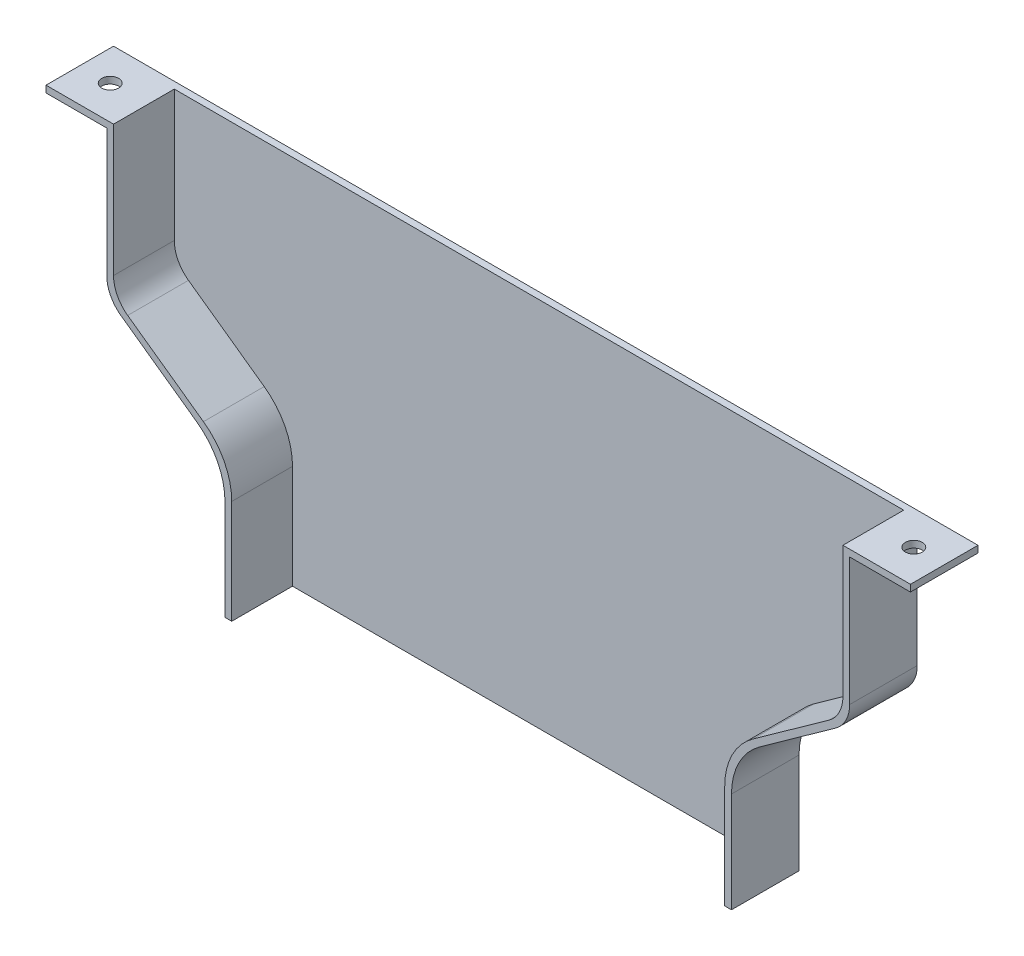
ISO-10303-21;
HEADER;
FILE_DESCRIPTION(('STEP AP214'),'2;1');
FILE_NAME('part.step','',(''),(''),'','','');
FILE_SCHEMA(('AUTOMOTIVE_DESIGN { 1 0 10303 214 1 1 1 1 }'));
ENDSEC;
DATA;
#1=APPLICATION_CONTEXT('core data for automotive mechanical design processes');
#2=APPLICATION_PROTOCOL_DEFINITION('international standard','automotive_design',2000,#1);
#3=PRODUCT_CONTEXT('',#1,'mechanical');
#4=PRODUCT('Part','Part','',(#3));
#5=PRODUCT_RELATED_PRODUCT_CATEGORY('part','',(#4));
#6=PRODUCT_DEFINITION_FORMATION('','',#4);
#7=PRODUCT_DEFINITION_CONTEXT('part definition',#1,'design');
#8=PRODUCT_DEFINITION('design','',#6,#7);
#9=PRODUCT_DEFINITION_SHAPE('','',#8);
#10=(LENGTH_UNIT() NAMED_UNIT(*) SI_UNIT(.MILLI.,.METRE.));
#11=(NAMED_UNIT(*) PLANE_ANGLE_UNIT() SI_UNIT($,.RADIAN.));
#12=(NAMED_UNIT(*) SI_UNIT($,.STERADIAN.) SOLID_ANGLE_UNIT());
#13=UNCERTAINTY_MEASURE_WITH_UNIT(LENGTH_MEASURE(1.E-05),#10,'distance_accuracy_value','');
#14=(GEOMETRIC_REPRESENTATION_CONTEXT(3) GLOBAL_UNCERTAINTY_ASSIGNED_CONTEXT((#13)) GLOBAL_UNIT_ASSIGNED_CONTEXT((#10,
#11,#12)) REPRESENTATION_CONTEXT('',''));
#15=CARTESIAN_POINT('',(0.,0.,0.));
#16=DIRECTION('',(0.,0.,1.));
#17=DIRECTION('',(1.,0.,0.));
#18=AXIS2_PLACEMENT_3D('',#15,#16,#17);
#19=CARTESIAN_POINT('',(-110.,110.,20.));
#20=DIRECTION('',(1.,0.,0.));
#21=DIRECTION('',(0.,1.,0.));
#22=AXIS2_PLACEMENT_3D('',#19,#20,#21);
#23=PLANE('',#22);
#24=DIRECTION('',(0.,0.,1.));
#25=VECTOR('',#24,1.);
#26=CARTESIAN_POINT('',(-110.,108.,20.));
#27=LINE('',#26,#25);
#28=CARTESIAN_POINT('',(-110.,108.,0.));
#29=VERTEX_POINT('',#28);
#30=CARTESIAN_POINT('',(-110.,108.,20.));
#31=VERTEX_POINT('',#30);
#32=EDGE_CURVE('E71',#29,#31,#27,.T.);
#33=ORIENTED_EDGE('',*,*,#32,.F.);
#34=DIRECTION('',(0.,-1.,0.));
#35=VECTOR('',#34,1.);
#36=CARTESIAN_POINT('',(-110.,110.,0.));
#37=LINE('',#36,#35);
#38=CARTESIAN_POINT('',(-110.,70.146178952918,0.));
#39=VERTEX_POINT('',#38);
#40=EDGE_CURVE('E354',#29,#39,#37,.T.);
#41=ORIENTED_EDGE('',*,*,#40,.T.);
#42=DIRECTION('',(0.,0.,-1.));
#43=VECTOR('',#42,1.);
#44=CARTESIAN_POINT('',(-110.,70.146178952918,20.));
#45=LINE('',#44,#43);
#46=CARTESIAN_POINT('',(-110.,70.146178952918,20.));
#47=VERTEX_POINT('',#46);
#48=EDGE_CURVE('E515',#39,#47,#45,.F.);
#49=ORIENTED_EDGE('',*,*,#48,.T.);
#50=DIRECTION('',(0.,-1.,0.));
#51=VECTOR('',#50,1.);
#52=CARTESIAN_POINT('',(-110.,110.,20.));
#53=LINE('',#52,#51);
#54=EDGE_CURVE('E67',#31,#47,#53,.T.);
#55=ORIENTED_EDGE('',*,*,#54,.F.);
#56=EDGE_LOOP('',(#33,#41,#49,#55));
#57=FACE_BOUND('',#56,.T.);
#58=ADVANCED_FACE('F51',(#57),#23,.F.);
#59=CARTESIAN_POINT('',(0.,0.,20.));
#60=DIRECTION('',(0.,0.,1.));
#61=DIRECTION('',(1.,0.,0.));
#62=AXIS2_PLACEMENT_3D('',#59,#60,#61);
#63=PLANE('',#62);
#64=DIRECTION('',(0.,1.,0.));
#65=VECTOR('',#64,1.);
#66=CARTESIAN_POINT('',(110.,110.,20.));
#67=LINE('',#66,#65);
#68=CARTESIAN_POINT('',(110.,70.1461789529181,20.));
#69=VERTEX_POINT('',#68);
#70=CARTESIAN_POINT('',(110.,108.,20.));
#71=VERTEX_POINT('',#70);
#72=EDGE_CURVE('E242',#69,#71,#67,.T.);
#73=ORIENTED_EDGE('',*,*,#72,.T.);
#74=DIRECTION('',(1.,0.,0.));
#75=VECTOR('',#74,1.);
#76=CARTESIAN_POINT('',(108.,108.,20.));
#77=LINE('',#76,#75);
#78=CARTESIAN_POINT('',(128.,108.,20.));
#79=VERTEX_POINT('',#78);
#80=EDGE_CURVE('E235',#71,#79,#77,.T.);
#81=ORIENTED_EDGE('',*,*,#80,.T.);
#82=DIRECTION('',(0.,1.,0.));
#83=VECTOR('',#82,1.);
#84=CARTESIAN_POINT('',(128.,108.,20.));
#85=LINE('',#84,#83);
#86=CARTESIAN_POINT('',(128.,110.,20.));
#87=VERTEX_POINT('',#86);
#88=EDGE_CURVE('E239',#79,#87,#85,.T.);
#89=ORIENTED_EDGE('',*,*,#88,.T.);
#90=DIRECTION('',(-1.,0.,0.));
#91=VECTOR('',#90,1.);
#92=CARTESIAN_POINT('',(110.,110.,20.));
#93=LINE('',#92,#91);
#94=CARTESIAN_POINT('',(108.,110.,20.));
#95=VERTEX_POINT('',#94);
#96=EDGE_CURVE('E380',#87,#95,#93,.T.);
#97=ORIENTED_EDGE('',*,*,#96,.T.);
#98=DIRECTION('',(0.,1.,0.));
#99=VECTOR('',#98,1.);
#100=CARTESIAN_POINT('',(108.,181.485608488668,20.));
#101=LINE('',#100,#99);
#102=CARTESIAN_POINT('',(108.,71.1754147435016,20.));
#103=VERTEX_POINT('',#102);
#104=EDGE_CURVE('E306',#103,#95,#101,.T.);
#105=ORIENTED_EDGE('',*,*,#104,.F.);
#106=CARTESIAN_POINT('',(98.,71.1754147435016,20.));
#107=DIRECTION('',(0.,0.,1.));
#108=DIRECTION('',(1.,0.,0.));
#109=AXIS2_PLACEMENT_3D('',#106,#107,#108);
#110=CIRCLE('',#109,10.);
#111=CARTESIAN_POINT('',(103.812381937191,63.0380800314342,20.));
#112=VERTEX_POINT('',#111);
#113=EDGE_CURVE('E60',#103,#112,#110,.F.);
#114=ORIENTED_EDGE('',*,*,#113,.T.);
#115=DIRECTION('',(0.813733471206735,0.581238193719096,0.));
#116=VECTOR('',#115,1.);
#117=CARTESIAN_POINT('',(108.,66.0292357905835,20.));
#118=LINE('',#117,#116);
#119=CARTESIAN_POINT('',(81.3752361256181,47.0115473088822,20.));
#120=VERTEX_POINT('',#119);
#121=EDGE_CURVE('E329',#120,#112,#118,.T.);
#122=ORIENTED_EDGE('',*,*,#121,.F.);
#123=CARTESIAN_POINT('',(93.,30.7368778847475,20.));
#124=DIRECTION('',(0.,0.,1.));
#125=DIRECTION('',(1.,0.,0.));
#126=AXIS2_PLACEMENT_3D('',#123,#124,#125);
#127=CIRCLE('',#126,20.);
#128=CARTESIAN_POINT('',(73.,30.7368778847475,20.));
#129=VERTEX_POINT('',#128);
#130=EDGE_CURVE('E476',#120,#129,#127,.T.);
#131=ORIENTED_EDGE('',*,*,#130,.T.);
#132=DIRECTION('',(0.,1.,0.));
#133=VECTOR('',#132,1.);
#134=CARTESIAN_POINT('',(73.,0.,20.));
#135=LINE('',#134,#133);
#136=CARTESIAN_POINT('',(73.,0.,20.));
#137=VERTEX_POINT('',#136);
#138=EDGE_CURVE('E419',#137,#129,#135,.T.);
#139=ORIENTED_EDGE('',*,*,#138,.F.);
#140=DIRECTION('',(1.,0.,0.));
#141=VECTOR('',#140,1.);
#142=CARTESIAN_POINT('',(-75.,0.,20.));
#143=LINE('',#142,#141);
#144=CARTESIAN_POINT('',(75.,0.,20.));
#145=VERTEX_POINT('',#144);
#146=EDGE_CURVE('E364',#137,#145,#143,.T.);
#147=ORIENTED_EDGE('',*,*,#146,.T.);
#148=DIRECTION('',(0.,1.,0.));
#149=VECTOR('',#148,1.);
#150=CARTESIAN_POINT('',(75.,40.,20.));
#151=LINE('',#150,#149);
#152=CARTESIAN_POINT('',(75.,29.7076420941639,20.));
#153=VERTEX_POINT('',#152);
#154=EDGE_CURVE('E369',#145,#153,#151,.T.);
#155=ORIENTED_EDGE('',*,*,#154,.T.);
#156=CARTESIAN_POINT('',(95.,29.707642094164,20.));
#157=DIRECTION('',(0.,0.,1.));
#158=DIRECTION('',(1.,0.,0.));
#159=AXIS2_PLACEMENT_3D('',#156,#157,#158);
#160=CIRCLE('',#159,20.);
#161=CARTESIAN_POINT('',(83.3752361256181,45.9823115182987,20.));
#162=VERTEX_POINT('',#161);
#163=EDGE_CURVE('E460',#153,#162,#160,.F.);
#164=ORIENTED_EDGE('',*,*,#163,.T.);
#165=DIRECTION('',(0.813733471206735,0.581238193719096,0.));
#166=VECTOR('',#165,1.);
#167=CARTESIAN_POINT('',(110.,65.,20.));
#168=LINE('',#167,#166);
#169=CARTESIAN_POINT('',(105.812381937191,62.0088442408507,20.));
#170=VERTEX_POINT('',#169);
#171=EDGE_CURVE('E373',#162,#170,#168,.T.);
#172=ORIENTED_EDGE('',*,*,#171,.T.);
#173=CARTESIAN_POINT('',(100.,70.146178952918,20.));
#174=DIRECTION('',(0.,0.,1.));
#175=DIRECTION('',(1.,0.,0.));
#176=AXIS2_PLACEMENT_3D('',#173,#174,#175);
#177=CIRCLE('',#176,10.);
#178=EDGE_CURVE('E528',#170,#69,#177,.T.);
#179=ORIENTED_EDGE('',*,*,#178,.T.);
#180=EDGE_LOOP('',(#73,#81,#89,#97,#105,#114,#122,#131,#139,#147,#155,#164,#172,#179));
#181=FACE_BOUND('',#180,.T.);
#182=ADVANCED_FACE('F237',(#181),#63,.T.);
#183=CARTESIAN_POINT('',(-110.,65.,20.));
#184=DIRECTION('',(0.581238193719096,0.813733471206736,0.));
#185=DIRECTION('',(-0.813733471206736,0.581238193719096,0.));
#186=AXIS2_PLACEMENT_3D('',#183,#184,#185);
#187=PLANE('',#186);
#188=DIRECTION('',(0.813733471206736,-0.581238193719096,0.));
#189=VECTOR('',#188,1.);
#190=CARTESIAN_POINT('',(-110.,65.,20.));
#191=LINE('',#190,#189);
#192=CARTESIAN_POINT('',(-105.812381937191,62.0088442408506,20.));
#193=VERTEX_POINT('',#192);
#194=CARTESIAN_POINT('',(-83.3752361256181,45.9823115182986,20.));
#195=VERTEX_POINT('',#194);
#196=EDGE_CURVE('E357',#193,#195,#191,.T.);
#197=ORIENTED_EDGE('',*,*,#196,.F.);
#198=DIRECTION('',(0.,0.,-1.));
#199=VECTOR('',#198,1.);
#200=CARTESIAN_POINT('',(-105.812381937191,62.0088442408506,20.));
#201=LINE('',#200,#199);
#202=CARTESIAN_POINT('',(-105.812381937191,62.0088442408506,0.));
#203=VERTEX_POINT('',#202);
#204=EDGE_CURVE('E504',#193,#203,#201,.T.);
#205=ORIENTED_EDGE('',*,*,#204,.T.);
#206=DIRECTION('',(0.813733471206736,-0.581238193719096,0.));
#207=VECTOR('',#206,1.);
#208=CARTESIAN_POINT('',(-110.,65.,0.));
#209=LINE('',#208,#207);
#210=CARTESIAN_POINT('',(-83.3752361256181,45.9823115182986,0.));
#211=VERTEX_POINT('',#210);
#212=EDGE_CURVE('E386',#203,#211,#209,.T.);
#213=ORIENTED_EDGE('',*,*,#212,.T.);
#214=DIRECTION('',(0.,0.,-1.));
#215=VECTOR('',#214,1.);
#216=CARTESIAN_POINT('',(-83.3752361256181,45.9823115182986,20.));
#217=LINE('',#216,#215);
#218=EDGE_CURVE('E438',#211,#195,#217,.F.);
#219=ORIENTED_EDGE('',*,*,#218,.T.);
#220=EDGE_LOOP('',(#197,#205,#213,#219));
#221=FACE_BOUND('',#220,.T.);
#222=ADVANCED_FACE('F611',(#221),#187,.F.);
#223=CARTESIAN_POINT('',(-75.,40.,20.));
#224=DIRECTION('',(1.,0.,0.));
#225=DIRECTION('',(0.,0.,-1.));
#226=AXIS2_PLACEMENT_3D('',#223,#224,#225);
#227=PLANE('',#226);
#228=DIRECTION('',(0.,-1.,0.));
#229=VECTOR('',#228,1.);
#230=CARTESIAN_POINT('',(-75.,40.,20.));
#231=LINE('',#230,#229);
#232=CARTESIAN_POINT('',(-75.,29.7076420941639,20.));
#233=VERTEX_POINT('',#232);
#234=CARTESIAN_POINT('',(-75.,0.,20.));
#235=VERTEX_POINT('',#234);
#236=EDGE_CURVE('E361',#233,#235,#231,.T.);
#237=ORIENTED_EDGE('',*,*,#236,.F.);
#238=DIRECTION('',(0.,0.,-1.));
#239=VECTOR('',#238,1.);
#240=CARTESIAN_POINT('',(-75.,29.7076420941639,0.));
#241=LINE('',#240,#239);
#242=CARTESIAN_POINT('',(-75.,29.7076420941639,0.));
#243=VERTEX_POINT('',#242);
#244=EDGE_CURVE('E434',#233,#243,#241,.T.);
#245=ORIENTED_EDGE('',*,*,#244,.T.);
#246=DIRECTION('',(0.,-1.,0.));
#247=VECTOR('',#246,1.);
#248=CARTESIAN_POINT('',(-75.,40.,0.));
#249=LINE('',#248,#247);
#250=CARTESIAN_POINT('',(-75.,0.,0.));
#251=VERTEX_POINT('',#250);
#252=EDGE_CURVE('E389',#243,#251,#249,.T.);
#253=ORIENTED_EDGE('',*,*,#252,.T.);
#254=DIRECTION('',(0.,0.,-1.));
#255=VECTOR('',#254,1.);
#256=CARTESIAN_POINT('',(-75.,0.,20.));
#257=LINE('',#256,#255);
#258=EDGE_CURVE('E412',#235,#251,#257,.T.);
#259=ORIENTED_EDGE('',*,*,#258,.F.);
#260=EDGE_LOOP('',(#237,#245,#253,#259));
#261=FACE_BOUND('',#260,.T.);
#262=ADVANCED_FACE('F622',(#261),#227,.F.);
#263=CARTESIAN_POINT('',(-75.,0.,20.));
#264=DIRECTION('',(0.,1.,0.));
#265=DIRECTION('',(-1.,0.,0.));
#266=AXIS2_PLACEMENT_3D('',#263,#264,#265);
#267=PLANE('',#266);
#268=ORIENTED_EDGE('',*,*,#146,.F.);
#269=DIRECTION('',(0.,0.,-1.));
#270=VECTOR('',#269,1.);
#271=CARTESIAN_POINT('',(73.,0.,20.));
#272=LINE('',#271,#270);
#273=CARTESIAN_POINT('',(73.,0.,2.));
#274=VERTEX_POINT('',#273);
#275=EDGE_CURVE('E342',#137,#274,#272,.T.);
#276=ORIENTED_EDGE('',*,*,#275,.T.);
#277=DIRECTION('',(-1.,0.,0.));
#278=VECTOR('',#277,1.);
#279=CARTESIAN_POINT('',(-75.,0.,2.));
#280=LINE('',#279,#278);
#281=CARTESIAN_POINT('',(-73.,0.,2.));
#282=VERTEX_POINT('',#281);
#283=EDGE_CURVE('E350',#274,#282,#280,.T.);
#284=ORIENTED_EDGE('',*,*,#283,.T.);
#285=DIRECTION('',(0.,0.,1.));
#286=VECTOR('',#285,1.);
#287=CARTESIAN_POINT('',(-73.,0.,20.));
#288=LINE('',#287,#286);
#289=CARTESIAN_POINT('',(-73.,0.,20.));
#290=VERTEX_POINT('',#289);
#291=EDGE_CURVE('E338',#282,#290,#288,.T.);
#292=ORIENTED_EDGE('',*,*,#291,.T.);
#293=EDGE_CURVE('E365',#235,#290,#143,.T.);
#294=ORIENTED_EDGE('',*,*,#293,.F.);
#295=ORIENTED_EDGE('',*,*,#258,.T.);
#296=DIRECTION('',(1.,0.,0.));
#297=VECTOR('',#296,1.);
#298=CARTESIAN_POINT('',(-75.,0.,0.));
#299=LINE('',#298,#297);
#300=CARTESIAN_POINT('',(75.,0.,0.));
#301=VERTEX_POINT('',#300);
#302=EDGE_CURVE('E392',#251,#301,#299,.T.);
#303=ORIENTED_EDGE('',*,*,#302,.T.);
#304=DIRECTION('',(0.,0.,-1.));
#305=VECTOR('',#304,1.);
#306=CARTESIAN_POINT('',(75.,0.,20.));
#307=LINE('',#306,#305);
#308=EDGE_CURVE('E383',#145,#301,#307,.T.);
#309=ORIENTED_EDGE('',*,*,#308,.F.);
#310=EDGE_LOOP('',(#268,#276,#284,#292,#294,#295,#303,#309));
#311=FACE_BOUND('',#310,.T.);
#312=ADVANCED_FACE('F577',(#311),#267,.F.);
#313=CARTESIAN_POINT('',(75.,40.,20.));
#314=DIRECTION('',(-1.,0.,0.));
#315=DIRECTION('',(0.,-1.,0.));
#316=AXIS2_PLACEMENT_3D('',#313,#314,#315);
#317=PLANE('',#316);
#318=DIRECTION('',(0.,1.,0.));
#319=VECTOR('',#318,1.);
#320=CARTESIAN_POINT('',(75.,40.,0.));
#321=LINE('',#320,#319);
#322=CARTESIAN_POINT('',(75.,29.7076420941639,0.));
#323=VERTEX_POINT('',#322);
#324=EDGE_CURVE('E395',#301,#323,#321,.T.);
#325=ORIENTED_EDGE('',*,*,#324,.T.);
#326=DIRECTION('',(0.,0.,-1.));
#327=VECTOR('',#326,1.);
#328=CARTESIAN_POINT('',(75.,29.7076420941639,20.));
#329=LINE('',#328,#327);
#330=EDGE_CURVE('E431',#323,#153,#329,.F.);
#331=ORIENTED_EDGE('',*,*,#330,.T.);
#332=ORIENTED_EDGE('',*,*,#154,.F.);
#333=ORIENTED_EDGE('',*,*,#308,.T.);
#334=EDGE_LOOP('',(#325,#331,#332,#333));
#335=FACE_BOUND('',#334,.T.);
#336=ADVANCED_FACE('F627',(#335),#317,.F.);
#337=CARTESIAN_POINT('',(110.,65.,20.));
#338=DIRECTION('',(-0.581238193719096,0.813733471206735,0.));
#339=DIRECTION('',(-0.813733471206735,-0.581238193719096,0.));
#340=AXIS2_PLACEMENT_3D('',#337,#338,#339);
#341=PLANE('',#340);
#342=DIRECTION('',(0.813733471206735,0.581238193719096,0.));
#343=VECTOR('',#342,1.);
#344=CARTESIAN_POINT('',(110.,65.,0.));
#345=LINE('',#344,#343);
#346=CARTESIAN_POINT('',(83.3752361256181,45.9823115182987,0.));
#347=VERTEX_POINT('',#346);
#348=CARTESIAN_POINT('',(105.812381937191,62.0088442408507,0.));
#349=VERTEX_POINT('',#348);
#350=EDGE_CURVE('E399',#347,#349,#345,.T.);
#351=ORIENTED_EDGE('',*,*,#350,.T.);
#352=DIRECTION('',(0.,0.,-1.));
#353=VECTOR('',#352,1.);
#354=CARTESIAN_POINT('',(105.812381937191,62.0088442408507,20.));
#355=LINE('',#354,#353);
#356=EDGE_CURVE('E525',#349,#170,#355,.F.);
#357=ORIENTED_EDGE('',*,*,#356,.T.);
#358=ORIENTED_EDGE('',*,*,#171,.F.);
#359=DIRECTION('',(0.,0.,-1.));
#360=VECTOR('',#359,1.);
#361=CARTESIAN_POINT('',(83.3752361256181,45.9823115182987,0.));
#362=LINE('',#361,#360);
#363=EDGE_CURVE('E427',#162,#347,#362,.T.);
#364=ORIENTED_EDGE('',*,*,#363,.T.);
#365=EDGE_LOOP('',(#351,#357,#358,#364));
#366=FACE_BOUND('',#365,.T.);
#367=ADVANCED_FACE('F635',(#366),#341,.F.);
#368=CARTESIAN_POINT('',(110.,110.,20.));
#369=DIRECTION('',(-1.,0.,0.));
#370=DIRECTION('',(0.,-1.,0.));
#371=AXIS2_PLACEMENT_3D('',#368,#369,#370);
#372=PLANE('',#371);
#373=DIRECTION('',(0.,1.,0.));
#374=VECTOR('',#373,1.);
#375=CARTESIAN_POINT('',(110.,110.,0.));
#376=LINE('',#375,#374);
#377=CARTESIAN_POINT('',(110.,70.1461789529181,0.));
#378=VERTEX_POINT('',#377);
#379=CARTESIAN_POINT('',(110.,108.,0.));
#380=VERTEX_POINT('',#379);
#381=EDGE_CURVE('E403',#378,#380,#376,.T.);
#382=ORIENTED_EDGE('',*,*,#381,.T.);
#383=DIRECTION('',(0.,0.,1.));
#384=VECTOR('',#383,1.);
#385=CARTESIAN_POINT('',(110.,108.,20.));
#386=LINE('',#385,#384);
#387=EDGE_CURVE('E298',#380,#71,#386,.T.);
#388=ORIENTED_EDGE('',*,*,#387,.T.);
#389=ORIENTED_EDGE('',*,*,#72,.F.);
#390=DIRECTION('',(0.,0.,-1.));
#391=VECTOR('',#390,1.);
#392=CARTESIAN_POINT('',(110.,70.146178952918,20.));
#393=LINE('',#392,#391);
#394=EDGE_CURVE('E521',#69,#378,#393,.T.);
#395=ORIENTED_EDGE('',*,*,#394,.T.);
#396=EDGE_LOOP('',(#382,#388,#389,#395));
#397=FACE_BOUND('',#396,.T.);
#398=ADVANCED_FACE('F640',(#397),#372,.F.);
#399=CARTESIAN_POINT('',(110.,110.,20.));
#400=DIRECTION('',(0.,-1.,0.));
#401=DIRECTION('',(1.,0.,0.));
#402=AXIS2_PLACEMENT_3D('',#399,#400,#401);
#403=PLANE('',#402);
#404=CARTESIAN_POINT('',(119.,110.,10.));
#405=DIRECTION('',(0.,-1.,0.));
#406=DIRECTION('',(1.,0.,0.));
#407=AXIS2_PLACEMENT_3D('',#404,#405,#406);
#408=CIRCLE('',#407,2.5);
#409=CARTESIAN_POINT('',(121.5,110.,10.));
#410=VERTEX_POINT('',#409);
#411=EDGE_CURVE('E282',#410,#410,#408,.T.);
#412=ORIENTED_EDGE('',*,*,#411,.T.);
#413=EDGE_LOOP('',(#412));
#414=FACE_BOUND('',#413,.T.);
#415=CARTESIAN_POINT('',(-119.,110.,9.99999999999997));
#416=DIRECTION('',(0.,-1.,0.));
#417=DIRECTION('',(1.,0.,0.));
#418=AXIS2_PLACEMENT_3D('',#415,#416,#417);
#419=CIRCLE('',#418,2.5);
#420=CARTESIAN_POINT('',(-116.5,110.,9.99999999999997));
#421=VERTEX_POINT('',#420);
#422=EDGE_CURVE('E893',#421,#421,#419,.T.);
#423=ORIENTED_EDGE('',*,*,#422,.T.);
#424=EDGE_LOOP('',(#423));
#425=FACE_BOUND('',#424,.T.);
#426=DIRECTION('',(1.,0.,0.));
#427=VECTOR('',#426,1.);
#428=CARTESIAN_POINT('',(110.,110.,2.));
#429=LINE('',#428,#427);
#430=CARTESIAN_POINT('',(-108.,110.,2.));
#431=VERTEX_POINT('',#430);
#432=CARTESIAN_POINT('',(108.,110.,2.));
#433=VERTEX_POINT('',#432);
#434=EDGE_CURVE('E423',#431,#433,#429,.T.);
#435=ORIENTED_EDGE('',*,*,#434,.T.);
#436=DIRECTION('',(0.,0.,1.));
#437=VECTOR('',#436,1.);
#438=CARTESIAN_POINT('',(108.,110.,20.));
#439=LINE('',#438,#437);
#440=EDGE_CURVE('E346',#433,#95,#439,.T.);
#441=ORIENTED_EDGE('',*,*,#440,.T.);
#442=ORIENTED_EDGE('',*,*,#96,.F.);
#443=DIRECTION('',(0.,0.,-1.));
#444=VECTOR('',#443,1.);
#445=CARTESIAN_POINT('',(128.,110.,20.));
#446=LINE('',#445,#444);
#447=CARTESIAN_POINT('',(128.,110.,0.));
#448=VERTEX_POINT('',#447);
#449=EDGE_CURVE('E248',#87,#448,#446,.T.);
#450=ORIENTED_EDGE('',*,*,#449,.T.);
#451=DIRECTION('',(-1.,0.,0.));
#452=VECTOR('',#451,1.);
#453=CARTESIAN_POINT('',(110.,110.,0.));
#454=LINE('',#453,#452);
#455=CARTESIAN_POINT('',(-128.,110.,0.));
#456=VERTEX_POINT('',#455);
#457=EDGE_CURVE('E358',#448,#456,#454,.T.);
#458=ORIENTED_EDGE('',*,*,#457,.T.);
#459=DIRECTION('',(0.,0.,1.));
#460=VECTOR('',#459,1.);
#461=CARTESIAN_POINT('',(-128.,110.,20.));
#462=LINE('',#461,#460);
#463=CARTESIAN_POINT('',(-128.,110.,20.));
#464=VERTEX_POINT('',#463);
#465=EDGE_CURVE('E270',#456,#464,#462,.T.);
#466=ORIENTED_EDGE('',*,*,#465,.T.);
#467=CARTESIAN_POINT('',(-108.,110.,20.));
#468=VERTEX_POINT('',#467);
#469=EDGE_CURVE('E379',#468,#464,#93,.T.);
#470=ORIENTED_EDGE('',*,*,#469,.F.);
#471=DIRECTION('',(0.,0.,-1.));
#472=VECTOR('',#471,1.);
#473=CARTESIAN_POINT('',(-108.,110.,20.));
#474=LINE('',#473,#472);
#475=EDGE_CURVE('E323',#468,#431,#474,.T.);
#476=ORIENTED_EDGE('',*,*,#475,.T.);
#477=EDGE_LOOP('',(#435,#441,#442,#450,#458,#466,#470,#476));
#478=FACE_BOUND('',#477,.T.);
#479=ADVANCED_FACE('F549',(#414,#425,#478),#403,.F.);
#480=ORIENTED_EDGE('',*,*,#469,.T.);
#481=DIRECTION('',(0.,1.,0.));
#482=VECTOR('',#481,1.);
#483=CARTESIAN_POINT('',(-128.,108.,20.));
#484=LINE('',#483,#482);
#485=CARTESIAN_POINT('',(-128.,108.,20.));
#486=VERTEX_POINT('',#485);
#487=EDGE_CURVE('E278',#486,#464,#484,.T.);
#488=ORIENTED_EDGE('',*,*,#487,.F.);
#489=DIRECTION('',(1.,0.,0.));
#490=VECTOR('',#489,1.);
#491=CARTESIAN_POINT('',(-108.,108.,20.));
#492=LINE('',#491,#490);
#493=EDGE_CURVE('E277',#486,#31,#492,.T.);
#494=ORIENTED_EDGE('',*,*,#493,.T.);
#495=ORIENTED_EDGE('',*,*,#54,.T.);
#496=CARTESIAN_POINT('',(-100.,70.146178952918,20.));
#497=DIRECTION('',(0.,0.,1.));
#498=DIRECTION('',(1.,0.,0.));
#499=AXIS2_PLACEMENT_3D('',#496,#497,#498);
#500=CIRCLE('',#499,10.);
#501=EDGE_CURVE('E518',#47,#193,#500,.T.);
#502=ORIENTED_EDGE('',*,*,#501,.T.);
#503=ORIENTED_EDGE('',*,*,#196,.T.);
#504=CARTESIAN_POINT('',(-95.,29.7076420941639,20.));
#505=DIRECTION('',(0.,0.,1.));
#506=DIRECTION('',(1.,0.,0.));
#507=AXIS2_PLACEMENT_3D('',#504,#505,#506);
#508=CIRCLE('',#507,20.);
#509=EDGE_CURVE('E467',#195,#233,#508,.F.);
#510=ORIENTED_EDGE('',*,*,#509,.T.);
#511=ORIENTED_EDGE('',*,*,#236,.T.);
#512=ORIENTED_EDGE('',*,*,#293,.T.);
#513=DIRECTION('',(0.,-1.,0.));
#514=VECTOR('',#513,1.);
#515=CARTESIAN_POINT('',(-73.,-7.12974786719496,20.));
#516=LINE('',#515,#514);
#517=CARTESIAN_POINT('',(-73.,30.7368778847475,20.));
#518=VERTEX_POINT('',#517);
#519=EDGE_CURVE('E326',#518,#290,#516,.T.);
#520=ORIENTED_EDGE('',*,*,#519,.F.);
#521=CARTESIAN_POINT('',(-93.,30.7368778847475,20.));
#522=DIRECTION('',(0.,0.,1.));
#523=DIRECTION('',(1.,0.,0.));
#524=AXIS2_PLACEMENT_3D('',#521,#522,#523);
#525=CIRCLE('',#524,20.);
#526=CARTESIAN_POINT('',(-81.3752361256181,47.0115473088822,20.));
#527=VERTEX_POINT('',#526);
#528=EDGE_CURVE('E479',#518,#527,#525,.T.);
#529=ORIENTED_EDGE('',*,*,#528,.T.);
#530=DIRECTION('',(0.813733471206735,-0.581238193719096,0.));
#531=VECTOR('',#530,1.);
#532=CARTESIAN_POINT('',(-108.,66.0292357905835,20.));
#533=LINE('',#532,#531);
#534=CARTESIAN_POINT('',(-103.812381937191,63.0380800314342,20.));
#535=VERTEX_POINT('',#534);
#536=EDGE_CURVE('E301',#535,#527,#533,.T.);
#537=ORIENTED_EDGE('',*,*,#536,.F.);
#538=CARTESIAN_POINT('',(-98.,71.1754147435016,20.));
#539=DIRECTION('',(0.,0.,1.));
#540=DIRECTION('',(1.,0.,0.));
#541=AXIS2_PLACEMENT_3D('',#538,#539,#540);
#542=CIRCLE('',#541,10.);
#543=CARTESIAN_POINT('',(-108.,71.1754147435016,20.));
#544=VERTEX_POINT('',#543);
#545=EDGE_CURVE('E11',#535,#544,#542,.F.);
#546=ORIENTED_EDGE('',*,*,#545,.T.);
#547=DIRECTION('',(0.,-1.,0.));
#548=VECTOR('',#547,1.);
#549=CARTESIAN_POINT('',(-108.,0.,20.));
#550=LINE('',#549,#548);
#551=EDGE_CURVE('E416',#468,#544,#550,.T.);
#552=ORIENTED_EDGE('',*,*,#551,.F.);
#553=EDGE_LOOP('',(#480,#488,#494,#495,#502,#503,#510,#511,#512,#520,#529,#537,#546,#552));
#554=FACE_BOUND('',#553,.T.);
#555=ADVANCED_FACE('F591',(#554),#63,.T.);
#556=CARTESIAN_POINT('',(0.,0.,0.));
#557=DIRECTION('',(0.,0.,1.));
#558=DIRECTION('',(1.,0.,0.));
#559=AXIS2_PLACEMENT_3D('',#556,#557,#558);
#560=PLANE('',#559);
#561=DIRECTION('',(0.,1.,0.));
#562=VECTOR('',#561,1.);
#563=CARTESIAN_POINT('',(-128.,108.,0.));
#564=LINE('',#563,#562);
#565=CARTESIAN_POINT('',(-128.,108.,0.));
#566=VERTEX_POINT('',#565);
#567=EDGE_CURVE('E273',#566,#456,#564,.T.);
#568=ORIENTED_EDGE('',*,*,#567,.T.);
#569=ORIENTED_EDGE('',*,*,#457,.F.);
#570=DIRECTION('',(0.,1.,0.));
#571=VECTOR('',#570,1.);
#572=CARTESIAN_POINT('',(128.,108.,0.));
#573=LINE('',#572,#571);
#574=CARTESIAN_POINT('',(128.,108.,0.));
#575=VERTEX_POINT('',#574);
#576=EDGE_CURVE('E257',#575,#448,#573,.T.);
#577=ORIENTED_EDGE('',*,*,#576,.F.);
#578=DIRECTION('',(-1.,0.,0.));
#579=VECTOR('',#578,1.);
#580=CARTESIAN_POINT('',(108.,108.,0.));
#581=LINE('',#580,#579);
#582=EDGE_CURVE('E258',#575,#380,#581,.T.);
#583=ORIENTED_EDGE('',*,*,#582,.T.);
#584=ORIENTED_EDGE('',*,*,#381,.F.);
#585=CARTESIAN_POINT('',(100.,70.146178952918,0.));
#586=DIRECTION('',(0.,0.,1.));
#587=DIRECTION('',(1.,0.,0.));
#588=AXIS2_PLACEMENT_3D('',#585,#586,#587);
#589=CIRCLE('',#588,10.);
#590=EDGE_CURVE('E508',#378,#349,#589,.F.);
#591=ORIENTED_EDGE('',*,*,#590,.T.);
#592=ORIENTED_EDGE('',*,*,#350,.F.);
#593=CARTESIAN_POINT('',(95.,29.707642094164,0.));
#594=DIRECTION('',(0.,0.,1.));
#595=DIRECTION('',(1.,0.,0.));
#596=AXIS2_PLACEMENT_3D('',#593,#594,#595);
#597=CIRCLE('',#596,20.);
#598=EDGE_CURVE('E457',#347,#323,#597,.T.);
#599=ORIENTED_EDGE('',*,*,#598,.T.);
#600=ORIENTED_EDGE('',*,*,#324,.F.);
#601=ORIENTED_EDGE('',*,*,#302,.F.);
#602=ORIENTED_EDGE('',*,*,#252,.F.);
#603=CARTESIAN_POINT('',(-95.,29.7076420941639,0.));
#604=DIRECTION('',(0.,0.,1.));
#605=DIRECTION('',(1.,0.,0.));
#606=AXIS2_PLACEMENT_3D('',#603,#604,#605);
#607=CIRCLE('',#606,20.);
#608=EDGE_CURVE('E463',#243,#211,#607,.T.);
#609=ORIENTED_EDGE('',*,*,#608,.T.);
#610=ORIENTED_EDGE('',*,*,#212,.F.);
#611=CARTESIAN_POINT('',(-100.,70.146178952918,0.));
#612=DIRECTION('',(0.,0.,1.));
#613=DIRECTION('',(1.,0.,0.));
#614=AXIS2_PLACEMENT_3D('',#611,#612,#613);
#615=CIRCLE('',#614,10.);
#616=EDGE_CURVE('E511',#203,#39,#615,.F.);
#617=ORIENTED_EDGE('',*,*,#616,.T.);
#618=ORIENTED_EDGE('',*,*,#40,.F.);
#619=DIRECTION('',(-1.,0.,0.));
#620=VECTOR('',#619,1.);
#621=CARTESIAN_POINT('',(-108.,108.,0.));
#622=LINE('',#621,#620);
#623=EDGE_CURVE('E286',#29,#566,#622,.T.);
#624=ORIENTED_EDGE('',*,*,#623,.T.);
#625=EDGE_LOOP('',(#568,#569,#577,#583,#584,#591,#592,#599,#600,#601,#602,#609,#610,#617,#618,#624));
#626=FACE_BOUND('',#625,.T.);
#627=ADVANCED_FACE('F599',(#626),#560,.F.);
#628=CARTESIAN_POINT('',(0.,0.,2.));
#629=DIRECTION('',(0.,0.,-1.));
#630=DIRECTION('',(-1.,0.,0.));
#631=AXIS2_PLACEMENT_3D('',#628,#629,#630);
#632=PLANE('',#631);
#633=DIRECTION('',(0.813733471206735,0.581238193719096,0.));
#634=VECTOR('',#633,1.);
#635=CARTESIAN_POINT('',(108.,66.0292357905835,2.));
#636=LINE('',#635,#634);
#637=CARTESIAN_POINT('',(81.3752361256181,47.0115473088822,2.));
#638=VERTEX_POINT('',#637);
#639=CARTESIAN_POINT('',(103.812381937191,63.0380800314342,2.));
#640=VERTEX_POINT('',#639);
#641=EDGE_CURVE('E316',#638,#640,#636,.T.);
#642=ORIENTED_EDGE('',*,*,#641,.T.);
#643=CARTESIAN_POINT('',(98.,71.1754147435016,2.));
#644=DIRECTION('',(0.,0.,-1.));
#645=DIRECTION('',(-1.,0.,0.));
#646=AXIS2_PLACEMENT_3D('',#643,#644,#645);
#647=CIRCLE('',#646,10.);
#648=CARTESIAN_POINT('',(108.,71.1754147435016,2.));
#649=VERTEX_POINT('',#648);
#650=EDGE_CURVE('E493',#640,#649,#647,.F.);
#651=ORIENTED_EDGE('',*,*,#650,.T.);
#652=DIRECTION('',(0.,1.,0.));
#653=VECTOR('',#652,1.);
#654=CARTESIAN_POINT('',(108.,181.485608488668,2.));
#655=LINE('',#654,#653);
#656=EDGE_CURVE('E320',#649,#433,#655,.T.);
#657=ORIENTED_EDGE('',*,*,#656,.T.);
#658=ORIENTED_EDGE('',*,*,#434,.F.);
#659=DIRECTION('',(0.,-1.,0.));
#660=VECTOR('',#659,1.);
#661=CARTESIAN_POINT('',(-108.,181.485608488668,2.));
#662=LINE('',#661,#660);
#663=CARTESIAN_POINT('',(-108.,71.1754147435016,2.));
#664=VERTEX_POINT('',#663);
#665=EDGE_CURVE('E302',#431,#664,#662,.T.);
#666=ORIENTED_EDGE('',*,*,#665,.T.);
#667=CARTESIAN_POINT('',(-98.,71.1754147435016,2.));
#668=DIRECTION('',(0.,0.,-1.));
#669=DIRECTION('',(-1.,0.,0.));
#670=AXIS2_PLACEMENT_3D('',#667,#668,#669);
#671=CIRCLE('',#670,10.);
#672=CARTESIAN_POINT('',(-103.812381937191,63.0380800314342,2.));
#673=VERTEX_POINT('',#672);
#674=EDGE_CURVE('E490',#664,#673,#671,.F.);
#675=ORIENTED_EDGE('',*,*,#674,.T.);
#676=DIRECTION('',(0.813733471206735,-0.581238193719096,0.));
#677=VECTOR('',#676,1.);
#678=CARTESIAN_POINT('',(-108.,66.0292357905835,2.));
#679=LINE('',#678,#677);
#680=CARTESIAN_POINT('',(-81.3752361256181,47.0115473088822,2.));
#681=VERTEX_POINT('',#680);
#682=EDGE_CURVE('E305',#673,#681,#679,.T.);
#683=ORIENTED_EDGE('',*,*,#682,.T.);
#684=CARTESIAN_POINT('',(-93.,30.7368778847475,2.));
#685=DIRECTION('',(0.,0.,-1.));
#686=DIRECTION('',(-1.,0.,0.));
#687=AXIS2_PLACEMENT_3D('',#684,#685,#686);
#688=CIRCLE('',#687,20.);
#689=CARTESIAN_POINT('',(-73.,30.7368778847475,2.));
#690=VERTEX_POINT('',#689);
#691=EDGE_CURVE('E473',#681,#690,#688,.T.);
#692=ORIENTED_EDGE('',*,*,#691,.T.);
#693=DIRECTION('',(0.,-1.,0.));
#694=VECTOR('',#693,1.);
#695=CARTESIAN_POINT('',(-73.,-7.12974786719496,2.));
#696=LINE('',#695,#694);
#697=EDGE_CURVE('E309',#690,#282,#696,.T.);
#698=ORIENTED_EDGE('',*,*,#697,.T.);
#699=ORIENTED_EDGE('',*,*,#283,.F.);
#700=DIRECTION('',(0.,1.,0.));
#701=VECTOR('',#700,1.);
#702=CARTESIAN_POINT('',(73.,-7.12974786719496,2.));
#703=LINE('',#702,#701);
#704=CARTESIAN_POINT('',(73.,30.7368778847475,2.));
#705=VERTEX_POINT('',#704);
#706=EDGE_CURVE('E312',#274,#705,#703,.T.);
#707=ORIENTED_EDGE('',*,*,#706,.T.);
#708=CARTESIAN_POINT('',(93.,30.7368778847475,2.));
#709=DIRECTION('',(0.,0.,-1.));
#710=DIRECTION('',(-1.,0.,0.));
#711=AXIS2_PLACEMENT_3D('',#708,#709,#710);
#712=CIRCLE('',#711,20.);
#713=EDGE_CURVE('E470',#705,#638,#712,.T.);
#714=ORIENTED_EDGE('',*,*,#713,.T.);
#715=EDGE_LOOP('',(#642,#651,#657,#658,#666,#675,#683,#692,#698,#699,#707,#714));
#716=FACE_BOUND('',#715,.T.);
#717=ADVANCED_FACE('F544',(#716),#632,.F.);
#718=CARTESIAN_POINT('',(108.,181.485608488668,2.));
#719=DIRECTION('',(1.,0.,0.));
#720=DIRECTION('',(0.,1.,0.));
#721=AXIS2_PLACEMENT_3D('',#718,#719,#720);
#722=PLANE('',#721);
#723=ORIENTED_EDGE('',*,*,#104,.T.);
#724=ORIENTED_EDGE('',*,*,#440,.F.);
#725=ORIENTED_EDGE('',*,*,#656,.F.);
#726=DIRECTION('',(0.,0.,1.));
#727=VECTOR('',#726,1.);
#728=CARTESIAN_POINT('',(108.,71.1754147435016,20.));
#729=LINE('',#728,#727);
#730=EDGE_CURVE('E483',#649,#103,#729,.T.);
#731=ORIENTED_EDGE('',*,*,#730,.T.);
#732=EDGE_LOOP('',(#723,#724,#725,#731));
#733=FACE_BOUND('',#732,.T.);
#734=ADVANCED_FACE('F547',(#733),#722,.F.);
#735=CARTESIAN_POINT('',(73.,-7.12974786719496,2.));
#736=DIRECTION('',(1.,0.,0.));
#737=DIRECTION('',(0.,0.,-1.));
#738=AXIS2_PLACEMENT_3D('',#735,#736,#737);
#739=PLANE('',#738);
#740=ORIENTED_EDGE('',*,*,#138,.T.);
#741=DIRECTION('',(0.,0.,1.));
#742=VECTOR('',#741,1.);
#743=CARTESIAN_POINT('',(73.,30.7368778847475,2.));
#744=LINE('',#743,#742);
#745=EDGE_CURVE('E446',#129,#705,#744,.F.);
#746=ORIENTED_EDGE('',*,*,#745,.T.);
#747=ORIENTED_EDGE('',*,*,#706,.F.);
#748=ORIENTED_EDGE('',*,*,#275,.F.);
#749=EDGE_LOOP('',(#740,#746,#747,#748));
#750=FACE_BOUND('',#749,.T.);
#751=ADVANCED_FACE('F581',(#750),#739,.F.);
#752=CARTESIAN_POINT('',(-73.,-7.12974786719496,2.));
#753=DIRECTION('',(-1.,0.,0.));
#754=DIRECTION('',(0.,0.,1.));
#755=AXIS2_PLACEMENT_3D('',#752,#753,#754);
#756=PLANE('',#755);
#757=ORIENTED_EDGE('',*,*,#697,.F.);
#758=DIRECTION('',(0.,0.,1.));
#759=VECTOR('',#758,1.);
#760=CARTESIAN_POINT('',(-73.,30.7368778847475,2.));
#761=LINE('',#760,#759);
#762=EDGE_CURVE('E449',#690,#518,#761,.T.);
#763=ORIENTED_EDGE('',*,*,#762,.T.);
#764=ORIENTED_EDGE('',*,*,#519,.T.);
#765=ORIENTED_EDGE('',*,*,#291,.F.);
#766=EDGE_LOOP('',(#757,#763,#764,#765));
#767=FACE_BOUND('',#766,.T.);
#768=ADVANCED_FACE('F572',(#767),#756,.F.);
#769=CARTESIAN_POINT('',(-108.,181.485608488668,2.));
#770=DIRECTION('',(-1.,0.,0.));
#771=DIRECTION('',(0.,-1.,0.));
#772=AXIS2_PLACEMENT_3D('',#769,#770,#771);
#773=PLANE('',#772);
#774=ORIENTED_EDGE('',*,*,#551,.T.);
#775=DIRECTION('',(0.,0.,1.));
#776=VECTOR('',#775,1.);
#777=CARTESIAN_POINT('',(-108.,71.1754147435016,2.));
#778=LINE('',#777,#776);
#779=EDGE_CURVE('E500',#544,#664,#778,.F.);
#780=ORIENTED_EDGE('',*,*,#779,.T.);
#781=ORIENTED_EDGE('',*,*,#665,.F.);
#782=ORIENTED_EDGE('',*,*,#475,.F.);
#783=EDGE_LOOP('',(#774,#780,#781,#782));
#784=FACE_BOUND('',#783,.T.);
#785=ADVANCED_FACE('F553',(#784),#773,.F.);
#786=CARTESIAN_POINT('',(108.,66.0292357905835,2.));
#787=DIRECTION('',(0.581238193719096,-0.813733471206736,0.));
#788=DIRECTION('',(0.813733471206736,0.581238193719096,0.));
#789=AXIS2_PLACEMENT_3D('',#786,#787,#788);
#790=PLANE('',#789);
#791=ORIENTED_EDGE('',*,*,#121,.T.);
#792=DIRECTION('',(0.,0.,1.));
#793=VECTOR('',#792,1.);
#794=CARTESIAN_POINT('',(103.812381937191,63.0380800314342,2.));
#795=LINE('',#794,#793);
#796=EDGE_CURVE('E487',#112,#640,#795,.F.);
#797=ORIENTED_EDGE('',*,*,#796,.T.);
#798=ORIENTED_EDGE('',*,*,#641,.F.);
#799=DIRECTION('',(0.,0.,1.));
#800=VECTOR('',#799,1.);
#801=CARTESIAN_POINT('',(81.3752361256181,47.0115473088822,2.));
#802=LINE('',#801,#800);
#803=EDGE_CURVE('E442',#638,#120,#802,.T.);
#804=ORIENTED_EDGE('',*,*,#803,.T.);
#805=EDGE_LOOP('',(#791,#797,#798,#804));
#806=FACE_BOUND('',#805,.T.);
#807=ADVANCED_FACE('F537',(#806),#790,.F.);
#808=CARTESIAN_POINT('',(-108.,66.0292357905835,2.));
#809=DIRECTION('',(-0.581238193719096,-0.813733471206736,0.));
#810=DIRECTION('',(0.813733471206736,-0.581238193719096,0.));
#811=AXIS2_PLACEMENT_3D('',#808,#809,#810);
#812=PLANE('',#811);
#813=ORIENTED_EDGE('',*,*,#682,.F.);
#814=DIRECTION('',(0.,0.,1.));
#815=VECTOR('',#814,1.);
#816=CARTESIAN_POINT('',(-103.812381937191,63.0380800314342,20.));
#817=LINE('',#816,#815);
#818=EDGE_CURVE('E496',#673,#535,#817,.T.);
#819=ORIENTED_EDGE('',*,*,#818,.T.);
#820=ORIENTED_EDGE('',*,*,#536,.T.);
#821=DIRECTION('',(0.,0.,1.));
#822=VECTOR('',#821,1.);
#823=CARTESIAN_POINT('',(-81.3752361256181,47.0115473088822,2.));
#824=LINE('',#823,#822);
#825=EDGE_CURVE('E453',#527,#681,#824,.F.);
#826=ORIENTED_EDGE('',*,*,#825,.T.);
#827=EDGE_LOOP('',(#813,#819,#820,#826));
#828=FACE_BOUND('',#827,.T.);
#829=ADVANCED_FACE('F562',(#828),#812,.F.);
#830=CARTESIAN_POINT('',(95.,29.707642094164,20.));
#831=DIRECTION('',(0.,0.,1.));
#832=DIRECTION('',(1.,0.,0.));
#833=AXIS2_PLACEMENT_3D('',#830,#831,#832);
#834=CYLINDRICAL_SURFACE('',#833,20.);
#835=ORIENTED_EDGE('',*,*,#163,.F.);
#836=ORIENTED_EDGE('',*,*,#330,.F.);
#837=ORIENTED_EDGE('',*,*,#598,.F.);
#838=ORIENTED_EDGE('',*,*,#363,.F.);
#839=EDGE_LOOP('',(#835,#836,#837,#838));
#840=FACE_BOUND('',#839,.T.);
#841=ADVANCED_FACE('F630',(#840),#834,.F.);
#842=CARTESIAN_POINT('',(-95.,29.7076420941639,20.));
#843=DIRECTION('',(0.,0.,1.));
#844=DIRECTION('',(1.,0.,0.));
#845=AXIS2_PLACEMENT_3D('',#842,#843,#844);
#846=CYLINDRICAL_SURFACE('',#845,20.);
#847=ORIENTED_EDGE('',*,*,#509,.F.);
#848=ORIENTED_EDGE('',*,*,#218,.F.);
#849=ORIENTED_EDGE('',*,*,#608,.F.);
#850=ORIENTED_EDGE('',*,*,#244,.F.);
#851=EDGE_LOOP('',(#847,#848,#849,#850));
#852=FACE_BOUND('',#851,.T.);
#853=ADVANCED_FACE('F618',(#852),#846,.F.);
#854=CARTESIAN_POINT('',(93.,30.7368778847475,2.));
#855=DIRECTION('',(0.,0.,1.));
#856=DIRECTION('',(1.,0.,0.));
#857=AXIS2_PLACEMENT_3D('',#854,#855,#856);
#858=CYLINDRICAL_SURFACE('',#857,20.);
#859=ORIENTED_EDGE('',*,*,#713,.F.);
#860=ORIENTED_EDGE('',*,*,#745,.F.);
#861=ORIENTED_EDGE('',*,*,#130,.F.);
#862=ORIENTED_EDGE('',*,*,#803,.F.);
#863=EDGE_LOOP('',(#859,#860,#861,#862));
#864=FACE_BOUND('',#863,.T.);
#865=ADVANCED_FACE('F585',(#864),#858,.T.);
#866=CARTESIAN_POINT('',(-93.,30.7368778847475,2.));
#867=DIRECTION('',(0.,0.,1.));
#868=DIRECTION('',(1.,0.,0.));
#869=AXIS2_PLACEMENT_3D('',#866,#867,#868);
#870=CYLINDRICAL_SURFACE('',#869,20.);
#871=ORIENTED_EDGE('',*,*,#691,.F.);
#872=ORIENTED_EDGE('',*,*,#825,.F.);
#873=ORIENTED_EDGE('',*,*,#528,.F.);
#874=ORIENTED_EDGE('',*,*,#762,.F.);
#875=EDGE_LOOP('',(#871,#872,#873,#874));
#876=FACE_BOUND('',#875,.T.);
#877=ADVANCED_FACE('F568',(#876),#870,.T.);
#878=CARTESIAN_POINT('',(98.,71.1754147435016,2.));
#879=DIRECTION('',(0.,0.,-1.));
#880=DIRECTION('',(-1.,0.,0.));
#881=AXIS2_PLACEMENT_3D('',#878,#879,#880);
#882=CYLINDRICAL_SURFACE('',#881,10.);
#883=ORIENTED_EDGE('',*,*,#650,.F.);
#884=ORIENTED_EDGE('',*,*,#796,.F.);
#885=ORIENTED_EDGE('',*,*,#113,.F.);
#886=ORIENTED_EDGE('',*,*,#730,.F.);
#887=EDGE_LOOP('',(#883,#884,#885,#886));
#888=FACE_BOUND('',#887,.T.);
#889=ADVANCED_FACE('F541',(#888),#882,.F.);
#890=CARTESIAN_POINT('',(-98.,71.1754147435016,2.));
#891=DIRECTION('',(0.,0.,-1.));
#892=DIRECTION('',(-1.,0.,0.));
#893=AXIS2_PLACEMENT_3D('',#890,#891,#892);
#894=CYLINDRICAL_SURFACE('',#893,10.);
#895=ORIENTED_EDGE('',*,*,#674,.F.);
#896=ORIENTED_EDGE('',*,*,#779,.F.);
#897=ORIENTED_EDGE('',*,*,#545,.F.);
#898=ORIENTED_EDGE('',*,*,#818,.F.);
#899=EDGE_LOOP('',(#895,#896,#897,#898));
#900=FACE_BOUND('',#899,.T.);
#901=ADVANCED_FACE('F559',(#900),#894,.F.);
#902=CARTESIAN_POINT('',(-100.,70.146178952918,20.));
#903=DIRECTION('',(0.,0.,-1.));
#904=DIRECTION('',(-1.,0.,0.));
#905=AXIS2_PLACEMENT_3D('',#902,#903,#904);
#906=CYLINDRICAL_SURFACE('',#905,10.);
#907=ORIENTED_EDGE('',*,*,#501,.F.);
#908=ORIENTED_EDGE('',*,*,#48,.F.);
#909=ORIENTED_EDGE('',*,*,#616,.F.);
#910=ORIENTED_EDGE('',*,*,#204,.F.);
#911=EDGE_LOOP('',(#907,#908,#909,#910));
#912=FACE_BOUND('',#911,.T.);
#913=ADVANCED_FACE('F608',(#912),#906,.T.);
#914=CARTESIAN_POINT('',(100.,70.146178952918,20.));
#915=DIRECTION('',(0.,0.,-1.));
#916=DIRECTION('',(-1.,0.,0.));
#917=AXIS2_PLACEMENT_3D('',#914,#915,#916);
#918=CYLINDRICAL_SURFACE('',#917,10.);
#919=ORIENTED_EDGE('',*,*,#178,.F.);
#920=ORIENTED_EDGE('',*,*,#356,.F.);
#921=ORIENTED_EDGE('',*,*,#590,.F.);
#922=ORIENTED_EDGE('',*,*,#394,.F.);
#923=EDGE_LOOP('',(#919,#920,#921,#922));
#924=FACE_BOUND('',#923,.T.);
#925=ADVANCED_FACE('F53',(#924),#918,.T.);
#926=CARTESIAN_POINT('',(0.,108.,0.));
#927=DIRECTION('',(0.,-1.,0.));
#928=DIRECTION('',(0.,0.,-1.));
#929=AXIS2_PLACEMENT_3D('',#926,#927,#928);
#930=PLANE('',#929);
#931=CARTESIAN_POINT('',(119.,108.,10.));
#932=DIRECTION('',(0.,-1.,0.));
#933=DIRECTION('',(0.,0.,-1.));
#934=AXIS2_PLACEMENT_3D('',#931,#932,#933);
#935=CIRCLE('',#934,2.5);
#936=CARTESIAN_POINT('',(119.,108.,7.50000000000001));
#937=VERTEX_POINT('',#936);
#938=EDGE_CURVE('E889',#937,#937,#935,.T.);
#939=ORIENTED_EDGE('',*,*,#938,.F.);
#940=EDGE_LOOP('',(#939));
#941=FACE_BOUND('',#940,.T.);
#942=ORIENTED_EDGE('',*,*,#387,.F.);
#943=ORIENTED_EDGE('',*,*,#582,.F.);
#944=DIRECTION('',(0.,0.,-1.));
#945=VECTOR('',#944,1.);
#946=CARTESIAN_POINT('',(128.,108.,20.));
#947=LINE('',#946,#945);
#948=EDGE_CURVE('E247',#79,#575,#947,.T.);
#949=ORIENTED_EDGE('',*,*,#948,.F.);
#950=ORIENTED_EDGE('',*,*,#80,.F.);
#951=EDGE_LOOP('',(#942,#943,#949,#950));
#952=FACE_BOUND('',#951,.T.);
#953=ADVANCED_FACE('F260',(#941,#952),#930,.T.);
#954=CARTESIAN_POINT('',(128.,108.,20.));
#955=DIRECTION('',(1.,0.,0.));
#956=DIRECTION('',(0.,1.,0.));
#957=AXIS2_PLACEMENT_3D('',#954,#955,#956);
#958=PLANE('',#957);
#959=ORIENTED_EDGE('',*,*,#449,.F.);
#960=ORIENTED_EDGE('',*,*,#88,.F.);
#961=ORIENTED_EDGE('',*,*,#948,.T.);
#962=ORIENTED_EDGE('',*,*,#576,.T.);
#963=EDGE_LOOP('',(#959,#960,#961,#962));
#964=FACE_BOUND('',#963,.T.);
#965=ADVANCED_FACE('F252',(#964),#958,.T.);
#966=CARTESIAN_POINT('',(0.,108.,0.));
#967=DIRECTION('',(0.,1.,0.));
#968=DIRECTION('',(0.,0.,1.));
#969=AXIS2_PLACEMENT_3D('',#966,#967,#968);
#970=PLANE('',#969);
#971=CARTESIAN_POINT('',(-119.,108.,9.99999999999997));
#972=DIRECTION('',(0.,-1.,0.));
#973=DIRECTION('',(0.,0.,1.));
#974=AXIS2_PLACEMENT_3D('',#971,#972,#973);
#975=CIRCLE('',#974,2.5);
#976=CARTESIAN_POINT('',(-119.,108.,12.5));
#977=VERTEX_POINT('',#976);
#978=EDGE_CURVE('E898',#977,#977,#975,.T.);
#979=ORIENTED_EDGE('',*,*,#978,.F.);
#980=EDGE_LOOP('',(#979));
#981=FACE_BOUND('',#980,.T.);
#982=ORIENTED_EDGE('',*,*,#623,.F.);
#983=ORIENTED_EDGE('',*,*,#32,.T.);
#984=ORIENTED_EDGE('',*,*,#493,.F.);
#985=DIRECTION('',(0.,0.,1.));
#986=VECTOR('',#985,1.);
#987=CARTESIAN_POINT('',(-128.,108.,20.));
#988=LINE('',#987,#986);
#989=EDGE_CURVE('E290',#566,#486,#988,.T.);
#990=ORIENTED_EDGE('',*,*,#989,.F.);
#991=EDGE_LOOP('',(#982,#983,#984,#990));
#992=FACE_BOUND('',#991,.T.);
#993=ADVANCED_FACE('F602',(#981,#992),#970,.F.);
#994=CARTESIAN_POINT('',(-128.,108.,20.));
#995=DIRECTION('',(-1.,0.,0.));
#996=DIRECTION('',(0.,-1.,0.));
#997=AXIS2_PLACEMENT_3D('',#994,#995,#996);
#998=PLANE('',#997);
#999=ORIENTED_EDGE('',*,*,#465,.F.);
#1000=ORIENTED_EDGE('',*,*,#567,.F.);
#1001=ORIENTED_EDGE('',*,*,#989,.T.);
#1002=ORIENTED_EDGE('',*,*,#487,.T.);
#1003=EDGE_LOOP('',(#999,#1000,#1001,#1002));
#1004=FACE_BOUND('',#1003,.T.);
#1005=ADVANCED_FACE('F594',(#1004),#998,.T.);
#1006=CARTESIAN_POINT('',(-119.,118.,9.99999999999997));
#1007=DIRECTION('',(0.,-1.,0.));
#1008=DIRECTION('',(0.,0.,-1.));
#1009=AXIS2_PLACEMENT_3D('',#1006,#1007,#1008);
#1010=CYLINDRICAL_SURFACE('',#1009,2.5);
#1011=ORIENTED_EDGE('',*,*,#978,.T.);
#1012=EDGE_LOOP('',(#1011));
#1013=FACE_BOUND('',#1012,.T.);
#1014=ORIENTED_EDGE('',*,*,#422,.F.);
#1015=EDGE_LOOP('',(#1014));
#1016=FACE_BOUND('',#1015,.T.);
#1017=ADVANCED_FACE('F689',(#1013,#1016),#1010,.F.);
#1018=CARTESIAN_POINT('',(119.,118.,10.));
#1019=DIRECTION('',(0.,-1.,0.));
#1020=DIRECTION('',(0.,0.,-1.));
#1021=AXIS2_PLACEMENT_3D('',#1018,#1019,#1020);
#1022=CYLINDRICAL_SURFACE('',#1021,2.5);
#1023=ORIENTED_EDGE('',*,*,#938,.T.);
#1024=EDGE_LOOP('',(#1023));
#1025=FACE_BOUND('',#1024,.T.);
#1026=ORIENTED_EDGE('',*,*,#411,.F.);
#1027=EDGE_LOOP('',(#1026));
#1028=FACE_BOUND('',#1027,.T.);
#1029=ADVANCED_FACE('F874',(#1025,#1028),#1022,.F.);
#1030=CLOSED_SHELL('',(#58,#182,#222,#262,#312,#336,#367,#398,#479,#555,#627,#717,#734,#751,
#768,#785,#807,#829,#841,#853,#865,#877,#889,#901,#913,#925,#953,#965,#993,#1005,#1017,#1029));
#1031=MANIFOLD_SOLID_BREP('B2',#1030);
#1032=ADVANCED_BREP_SHAPE_REPRESENTATION('',(#18,#1031),#14);
#1033=SHAPE_DEFINITION_REPRESENTATION(#9,#1032);
ENDSEC;
END-ISO-10303-21;
